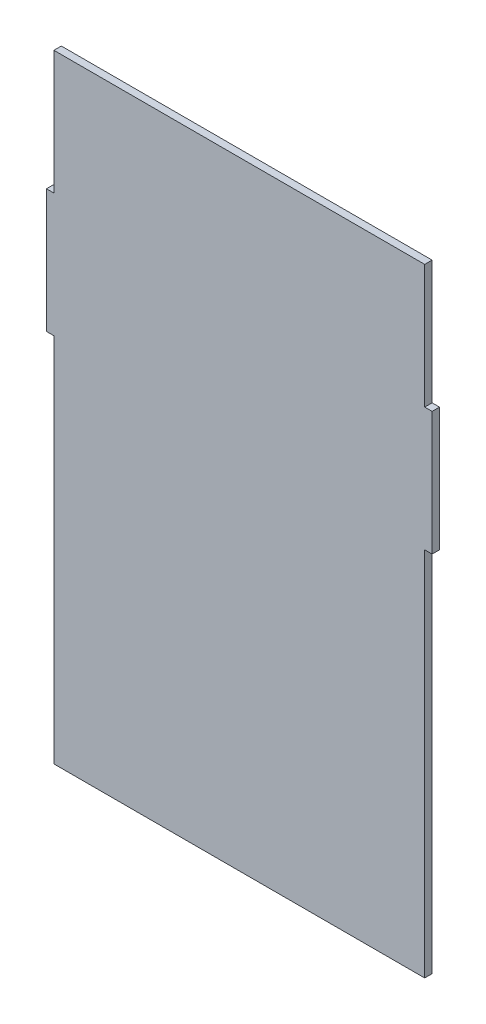
ISO-10303-21;
HEADER;
FILE_DESCRIPTION(('STEP AP214'),'2;1');
FILE_NAME('part.step','',(''),(''),'','','');
FILE_SCHEMA(('AUTOMOTIVE_DESIGN { 1 0 10303 214 1 1 1 1 }'));
ENDSEC;
DATA;
#1=APPLICATION_CONTEXT('core data for automotive mechanical design processes');
#2=APPLICATION_PROTOCOL_DEFINITION('international standard','automotive_design',2000,#1);
#3=PRODUCT_CONTEXT('',#1,'mechanical');
#4=PRODUCT('Part','Part','',(#3));
#5=PRODUCT_RELATED_PRODUCT_CATEGORY('part','',(#4));
#6=PRODUCT_DEFINITION_FORMATION('','',#4);
#7=PRODUCT_DEFINITION_CONTEXT('part definition',#1,'design');
#8=PRODUCT_DEFINITION('design','',#6,#7);
#9=PRODUCT_DEFINITION_SHAPE('','',#8);
#10=(LENGTH_UNIT() NAMED_UNIT(*) SI_UNIT(.MILLI.,.METRE.));
#11=(NAMED_UNIT(*) PLANE_ANGLE_UNIT() SI_UNIT($,.RADIAN.));
#12=(NAMED_UNIT(*) SI_UNIT($,.STERADIAN.) SOLID_ANGLE_UNIT());
#13=UNCERTAINTY_MEASURE_WITH_UNIT(LENGTH_MEASURE(1.E-05),#10,'distance_accuracy_value','');
#14=(GEOMETRIC_REPRESENTATION_CONTEXT(3) GLOBAL_UNCERTAINTY_ASSIGNED_CONTEXT((#13)) GLOBAL_UNIT_ASSIGNED_CONTEXT((#10,
#11,#12)) REPRESENTATION_CONTEXT('',''));
#15=CARTESIAN_POINT('',(0.,0.,0.));
#16=DIRECTION('',(0.,0.,1.));
#17=DIRECTION('',(1.,0.,0.));
#18=AXIS2_PLACEMENT_3D('',#15,#16,#17);
#19=CARTESIAN_POINT('',(0.,0.,3.));
#20=DIRECTION('',(1.,0.,0.));
#21=DIRECTION('',(0.,1.,0.));
#22=AXIS2_PLACEMENT_3D('',#19,#20,#21);
#23=PLANE('',#22);
#24=DIRECTION('',(0.,-1.,0.));
#25=VECTOR('',#24,1.);
#26=CARTESIAN_POINT('',(0.,0.,0.));
#27=LINE('',#26,#25);
#28=CARTESIAN_POINT('',(0.,150.,0.));
#29=VERTEX_POINT('',#28);
#30=CARTESIAN_POINT('',(0.,0.,0.));
#31=VERTEX_POINT('',#30);
#32=EDGE_CURVE('E164',#29,#31,#27,.T.);
#33=ORIENTED_EDGE('',*,*,#32,.T.);
#34=DIRECTION('',(0.,0.,-1.));
#35=VECTOR('',#34,1.);
#36=CARTESIAN_POINT('',(0.,0.,3.));
#37=LINE('',#36,#35);
#38=CARTESIAN_POINT('',(0.,0.,3.));
#39=VERTEX_POINT('',#38);
#40=EDGE_CURVE('E11',#39,#31,#37,.T.);
#41=ORIENTED_EDGE('',*,*,#40,.F.);
#42=DIRECTION('',(0.,-1.,0.));
#43=VECTOR('',#42,1.);
#44=CARTESIAN_POINT('',(0.,0.,3.));
#45=LINE('',#44,#43);
#46=CARTESIAN_POINT('',(0.,150.,3.));
#47=VERTEX_POINT('',#46);
#48=EDGE_CURVE('E198',#47,#39,#45,.T.);
#49=ORIENTED_EDGE('',*,*,#48,.F.);
#50=DIRECTION('',(0.,0.,-1.));
#51=VECTOR('',#50,1.);
#52=CARTESIAN_POINT('',(0.,150.,3.));
#53=LINE('',#52,#51);
#54=EDGE_CURVE('E160',#47,#29,#53,.T.);
#55=ORIENTED_EDGE('',*,*,#54,.T.);
#56=EDGE_LOOP('',(#33,#41,#49,#55));
#57=FACE_BOUND('',#56,.T.);
#58=ADVANCED_FACE('F39',(#57),#23,.F.);
#59=CARTESIAN_POINT('',(0.,0.,3.));
#60=DIRECTION('',(0.,1.,0.));
#61=DIRECTION('',(0.,0.,1.));
#62=AXIS2_PLACEMENT_3D('',#59,#60,#61);
#63=PLANE('',#62);
#64=DIRECTION('',(1.,0.,0.));
#65=VECTOR('',#64,1.);
#66=CARTESIAN_POINT('',(0.,0.,0.));
#67=LINE('',#66,#65);
#68=CARTESIAN_POINT('',(150.,0.,0.));
#69=VERTEX_POINT('',#68);
#70=EDGE_CURVE('E168',#31,#69,#67,.T.);
#71=ORIENTED_EDGE('',*,*,#70,.T.);
#72=DIRECTION('',(0.,0.,-1.));
#73=VECTOR('',#72,1.);
#74=CARTESIAN_POINT('',(150.,0.,3.));
#75=LINE('',#74,#73);
#76=CARTESIAN_POINT('',(150.,0.,3.));
#77=VERTEX_POINT('',#76);
#78=EDGE_CURVE('E48',#77,#69,#75,.T.);
#79=ORIENTED_EDGE('',*,*,#78,.F.);
#80=DIRECTION('',(1.,0.,0.));
#81=VECTOR('',#80,1.);
#82=CARTESIAN_POINT('',(0.,0.,3.));
#83=LINE('',#82,#81);
#84=EDGE_CURVE('E111',#39,#77,#83,.T.);
#85=ORIENTED_EDGE('',*,*,#84,.F.);
#86=ORIENTED_EDGE('',*,*,#40,.T.);
#87=EDGE_LOOP('',(#71,#79,#85,#86));
#88=FACE_BOUND('',#87,.T.);
#89=ADVANCED_FACE('F292',(#88),#63,.F.);
#90=CARTESIAN_POINT('',(150.,0.,3.));
#91=DIRECTION('',(-1.,0.,0.));
#92=DIRECTION('',(0.,0.,1.));
#93=AXIS2_PLACEMENT_3D('',#90,#91,#92);
#94=PLANE('',#93);
#95=DIRECTION('',(0.,1.,0.));
#96=VECTOR('',#95,1.);
#97=CARTESIAN_POINT('',(150.,0.,0.));
#98=LINE('',#97,#96);
#99=CARTESIAN_POINT('',(150.,150.,0.));
#100=VERTEX_POINT('',#99);
#101=EDGE_CURVE('E171',#69,#100,#98,.T.);
#102=ORIENTED_EDGE('',*,*,#101,.T.);
#103=DIRECTION('',(0.,0.,-1.));
#104=VECTOR('',#103,1.);
#105=CARTESIAN_POINT('',(150.,150.,3.));
#106=LINE('',#105,#104);
#107=CARTESIAN_POINT('',(150.,150.,3.));
#108=VERTEX_POINT('',#107);
#109=EDGE_CURVE('E225',#108,#100,#106,.T.);
#110=ORIENTED_EDGE('',*,*,#109,.F.);
#111=DIRECTION('',(0.,1.,0.));
#112=VECTOR('',#111,1.);
#113=CARTESIAN_POINT('',(150.,0.,3.));
#114=LINE('',#113,#112);
#115=EDGE_CURVE('E235',#77,#108,#114,.T.);
#116=ORIENTED_EDGE('',*,*,#115,.F.);
#117=ORIENTED_EDGE('',*,*,#78,.T.);
#118=EDGE_LOOP('',(#102,#110,#116,#117));
#119=FACE_BOUND('',#118,.T.);
#120=ADVANCED_FACE('F233',(#119),#94,.F.);
#121=CARTESIAN_POINT('',(150.,150.,3.));
#122=DIRECTION('',(0.,1.,0.));
#123=DIRECTION('',(0.,0.,1.));
#124=AXIS2_PLACEMENT_3D('',#121,#122,#123);
#125=PLANE('',#124);
#126=DIRECTION('',(1.,0.,0.));
#127=VECTOR('',#126,1.);
#128=CARTESIAN_POINT('',(150.,150.,0.));
#129=LINE('',#128,#127);
#130=CARTESIAN_POINT('',(153.,150.,0.));
#131=VERTEX_POINT('',#130);
#132=EDGE_CURVE('E174',#100,#131,#129,.T.);
#133=ORIENTED_EDGE('',*,*,#132,.T.);
#134=DIRECTION('',(0.,0.,-1.));
#135=VECTOR('',#134,1.);
#136=CARTESIAN_POINT('',(153.,150.,3.));
#137=LINE('',#136,#135);
#138=CARTESIAN_POINT('',(153.,150.,3.));
#139=VERTEX_POINT('',#138);
#140=EDGE_CURVE('E221',#139,#131,#137,.T.);
#141=ORIENTED_EDGE('',*,*,#140,.F.);
#142=DIRECTION('',(1.,0.,0.));
#143=VECTOR('',#142,1.);
#144=CARTESIAN_POINT('',(150.,150.,3.));
#145=LINE('',#144,#143);
#146=EDGE_CURVE('E254',#108,#139,#145,.T.);
#147=ORIENTED_EDGE('',*,*,#146,.F.);
#148=ORIENTED_EDGE('',*,*,#109,.T.);
#149=EDGE_LOOP('',(#133,#141,#147,#148));
#150=FACE_BOUND('',#149,.T.);
#151=ADVANCED_FACE('F244',(#150),#125,.F.);
#152=CARTESIAN_POINT('',(153.,150.,3.));
#153=DIRECTION('',(-1.,0.,0.));
#154=DIRECTION('',(0.,0.,1.));
#155=AXIS2_PLACEMENT_3D('',#152,#153,#154);
#156=PLANE('',#155);
#157=DIRECTION('',(0.,1.,0.));
#158=VECTOR('',#157,1.);
#159=CARTESIAN_POINT('',(153.,150.,0.));
#160=LINE('',#159,#158);
#161=CARTESIAN_POINT('',(153.,200.,0.));
#162=VERTEX_POINT('',#161);
#163=EDGE_CURVE('E177',#131,#162,#160,.T.);
#164=ORIENTED_EDGE('',*,*,#163,.T.);
#165=DIRECTION('',(0.,0.,-1.));
#166=VECTOR('',#165,1.);
#167=CARTESIAN_POINT('',(153.,200.,3.));
#168=LINE('',#167,#166);
#169=CARTESIAN_POINT('',(153.,200.,3.));
#170=VERTEX_POINT('',#169);
#171=EDGE_CURVE('E217',#170,#162,#168,.T.);
#172=ORIENTED_EDGE('',*,*,#171,.F.);
#173=DIRECTION('',(0.,1.,0.));
#174=VECTOR('',#173,1.);
#175=CARTESIAN_POINT('',(153.,150.,3.));
#176=LINE('',#175,#174);
#177=EDGE_CURVE('E250',#139,#170,#176,.T.);
#178=ORIENTED_EDGE('',*,*,#177,.F.);
#179=ORIENTED_EDGE('',*,*,#140,.T.);
#180=EDGE_LOOP('',(#164,#172,#178,#179));
#181=FACE_BOUND('',#180,.T.);
#182=ADVANCED_FACE('F248',(#181),#156,.F.);
#183=CARTESIAN_POINT('',(150.,200.,3.));
#184=DIRECTION('',(0.,-1.,0.));
#185=DIRECTION('',(0.,0.,-1.));
#186=AXIS2_PLACEMENT_3D('',#183,#184,#185);
#187=PLANE('',#186);
#188=DIRECTION('',(-1.,0.,0.));
#189=VECTOR('',#188,1.);
#190=CARTESIAN_POINT('',(150.,200.,0.));
#191=LINE('',#190,#189);
#192=CARTESIAN_POINT('',(150.,200.,0.));
#193=VERTEX_POINT('',#192);
#194=EDGE_CURVE('E180',#162,#193,#191,.T.);
#195=ORIENTED_EDGE('',*,*,#194,.T.);
#196=DIRECTION('',(0.,0.,-1.));
#197=VECTOR('',#196,1.);
#198=CARTESIAN_POINT('',(150.,200.,3.));
#199=LINE('',#198,#197);
#200=CARTESIAN_POINT('',(150.,200.,3.));
#201=VERTEX_POINT('',#200);
#202=EDGE_CURVE('E213',#201,#193,#199,.T.);
#203=ORIENTED_EDGE('',*,*,#202,.F.);
#204=DIRECTION('',(-1.,0.,0.));
#205=VECTOR('',#204,1.);
#206=CARTESIAN_POINT('',(150.,200.,3.));
#207=LINE('',#206,#205);
#208=EDGE_CURVE('E253',#170,#201,#207,.T.);
#209=ORIENTED_EDGE('',*,*,#208,.F.);
#210=ORIENTED_EDGE('',*,*,#171,.T.);
#211=EDGE_LOOP('',(#195,#203,#209,#210));
#212=FACE_BOUND('',#211,.T.);
#213=ADVANCED_FACE('F305',(#212),#187,.F.);
#214=CARTESIAN_POINT('',(150.,200.,3.));
#215=DIRECTION('',(-1.,0.,0.));
#216=DIRECTION('',(0.,0.,1.));
#217=AXIS2_PLACEMENT_3D('',#214,#215,#216);
#218=PLANE('',#217);
#219=DIRECTION('',(0.,1.,0.));
#220=VECTOR('',#219,1.);
#221=CARTESIAN_POINT('',(150.,200.,0.));
#222=LINE('',#221,#220);
#223=CARTESIAN_POINT('',(150.,250.,0.));
#224=VERTEX_POINT('',#223);
#225=EDGE_CURVE('E183',#193,#224,#222,.T.);
#226=ORIENTED_EDGE('',*,*,#225,.T.);
#227=DIRECTION('',(0.,0.,-1.));
#228=VECTOR('',#227,1.);
#229=CARTESIAN_POINT('',(150.,250.,3.));
#230=LINE('',#229,#228);
#231=CARTESIAN_POINT('',(150.,250.,3.));
#232=VERTEX_POINT('',#231);
#233=EDGE_CURVE('E209',#232,#224,#230,.T.);
#234=ORIENTED_EDGE('',*,*,#233,.F.);
#235=DIRECTION('',(0.,1.,0.));
#236=VECTOR('',#235,1.);
#237=CARTESIAN_POINT('',(150.,200.,3.));
#238=LINE('',#237,#236);
#239=EDGE_CURVE('E258',#201,#232,#238,.T.);
#240=ORIENTED_EDGE('',*,*,#239,.F.);
#241=ORIENTED_EDGE('',*,*,#202,.T.);
#242=EDGE_LOOP('',(#226,#234,#240,#241));
#243=FACE_BOUND('',#242,.T.);
#244=ADVANCED_FACE('F308',(#243),#218,.F.);
#245=CARTESIAN_POINT('',(0.,250.,3.));
#246=DIRECTION('',(0.,-1.,0.));
#247=DIRECTION('',(0.,0.,-1.));
#248=AXIS2_PLACEMENT_3D('',#245,#246,#247);
#249=PLANE('',#248);
#250=DIRECTION('',(-1.,0.,0.));
#251=VECTOR('',#250,1.);
#252=CARTESIAN_POINT('',(0.,250.,0.));
#253=LINE('',#252,#251);
#254=CARTESIAN_POINT('',(0.,250.,0.));
#255=VERTEX_POINT('',#254);
#256=EDGE_CURVE('E186',#224,#255,#253,.T.);
#257=ORIENTED_EDGE('',*,*,#256,.T.);
#258=DIRECTION('',(0.,0.,-1.));
#259=VECTOR('',#258,1.);
#260=CARTESIAN_POINT('',(0.,250.,3.));
#261=LINE('',#260,#259);
#262=CARTESIAN_POINT('',(0.,250.,3.));
#263=VERTEX_POINT('',#262);
#264=EDGE_CURVE('E205',#263,#255,#261,.T.);
#265=ORIENTED_EDGE('',*,*,#264,.F.);
#266=DIRECTION('',(-1.,0.,0.));
#267=VECTOR('',#266,1.);
#268=CARTESIAN_POINT('',(0.,250.,3.));
#269=LINE('',#268,#267);
#270=EDGE_CURVE('E265',#232,#263,#269,.T.);
#271=ORIENTED_EDGE('',*,*,#270,.F.);
#272=ORIENTED_EDGE('',*,*,#233,.T.);
#273=EDGE_LOOP('',(#257,#265,#271,#272));
#274=FACE_BOUND('',#273,.T.);
#275=ADVANCED_FACE('F273',(#274),#249,.F.);
#276=CARTESIAN_POINT('',(0.,200.,3.));
#277=DIRECTION('',(1.,0.,0.));
#278=DIRECTION('',(0.,1.,0.));
#279=AXIS2_PLACEMENT_3D('',#276,#277,#278);
#280=PLANE('',#279);
#281=DIRECTION('',(0.,-1.,0.));
#282=VECTOR('',#281,1.);
#283=CARTESIAN_POINT('',(0.,200.,0.));
#284=LINE('',#283,#282);
#285=CARTESIAN_POINT('',(0.,200.,0.));
#286=VERTEX_POINT('',#285);
#287=EDGE_CURVE('E189',#255,#286,#284,.T.);
#288=ORIENTED_EDGE('',*,*,#287,.T.);
#289=DIRECTION('',(0.,0.,-1.));
#290=VECTOR('',#289,1.);
#291=CARTESIAN_POINT('',(0.,200.,3.));
#292=LINE('',#291,#290);
#293=CARTESIAN_POINT('',(0.,200.,3.));
#294=VERTEX_POINT('',#293);
#295=EDGE_CURVE('E153',#294,#286,#292,.T.);
#296=ORIENTED_EDGE('',*,*,#295,.F.);
#297=DIRECTION('',(0.,-1.,0.));
#298=VECTOR('',#297,1.);
#299=CARTESIAN_POINT('',(0.,200.,3.));
#300=LINE('',#299,#298);
#301=EDGE_CURVE('E142',#263,#294,#300,.T.);
#302=ORIENTED_EDGE('',*,*,#301,.F.);
#303=ORIENTED_EDGE('',*,*,#264,.T.);
#304=EDGE_LOOP('',(#288,#296,#302,#303));
#305=FACE_BOUND('',#304,.T.);
#306=ADVANCED_FACE('F277',(#305),#280,.F.);
#307=CARTESIAN_POINT('',(0.,200.,3.));
#308=DIRECTION('',(0.,-1.,0.));
#309=DIRECTION('',(0.,0.,-1.));
#310=AXIS2_PLACEMENT_3D('',#307,#308,#309);
#311=PLANE('',#310);
#312=DIRECTION('',(-1.,0.,0.));
#313=VECTOR('',#312,1.);
#314=CARTESIAN_POINT('',(0.,200.,0.));
#315=LINE('',#314,#313);
#316=CARTESIAN_POINT('',(-3.00000000000001,200.,0.));
#317=VERTEX_POINT('',#316);
#318=EDGE_CURVE('E151',#286,#317,#315,.T.);
#319=ORIENTED_EDGE('',*,*,#318,.T.);
#320=DIRECTION('',(0.,0.,-1.));
#321=VECTOR('',#320,1.);
#322=CARTESIAN_POINT('',(-3.00000000000001,200.,3.));
#323=LINE('',#322,#321);
#324=CARTESIAN_POINT('',(-3.00000000000001,200.,3.));
#325=VERTEX_POINT('',#324);
#326=EDGE_CURVE('E148',#325,#317,#323,.T.);
#327=ORIENTED_EDGE('',*,*,#326,.F.);
#328=DIRECTION('',(-1.,0.,0.));
#329=VECTOR('',#328,1.);
#330=CARTESIAN_POINT('',(0.,200.,3.));
#331=LINE('',#330,#329);
#332=EDGE_CURVE('E136',#294,#325,#331,.T.);
#333=ORIENTED_EDGE('',*,*,#332,.F.);
#334=ORIENTED_EDGE('',*,*,#295,.T.);
#335=EDGE_LOOP('',(#319,#327,#333,#334));
#336=FACE_BOUND('',#335,.T.);
#337=ADVANCED_FACE('F149',(#336),#311,.F.);
#338=CARTESIAN_POINT('',(-3.00000000000001,200.,3.));
#339=DIRECTION('',(1.,0.,0.));
#340=DIRECTION('',(0.,0.,-1.));
#341=AXIS2_PLACEMENT_3D('',#338,#339,#340);
#342=PLANE('',#341);
#343=DIRECTION('',(0.,-1.,0.));
#344=VECTOR('',#343,1.);
#345=CARTESIAN_POINT('',(-3.00000000000001,200.,0.));
#346=LINE('',#345,#344);
#347=CARTESIAN_POINT('',(-3.00000000000001,150.,0.));
#348=VERTEX_POINT('',#347);
#349=EDGE_CURVE('E97',#317,#348,#346,.T.);
#350=ORIENTED_EDGE('',*,*,#349,.T.);
#351=DIRECTION('',(0.,0.,-1.));
#352=VECTOR('',#351,1.);
#353=CARTESIAN_POINT('',(-3.00000000000001,150.,3.));
#354=LINE('',#353,#352);
#355=CARTESIAN_POINT('',(-3.00000000000001,150.,3.));
#356=VERTEX_POINT('',#355);
#357=EDGE_CURVE('E154',#356,#348,#354,.T.);
#358=ORIENTED_EDGE('',*,*,#357,.F.);
#359=DIRECTION('',(0.,-1.,0.));
#360=VECTOR('',#359,1.);
#361=CARTESIAN_POINT('',(-3.00000000000001,200.,3.));
#362=LINE('',#361,#360);
#363=EDGE_CURVE('E140',#325,#356,#362,.T.);
#364=ORIENTED_EDGE('',*,*,#363,.F.);
#365=ORIENTED_EDGE('',*,*,#326,.T.);
#366=EDGE_LOOP('',(#350,#358,#364,#365));
#367=FACE_BOUND('',#366,.T.);
#368=ADVANCED_FACE('F156',(#367),#342,.F.);
#369=CARTESIAN_POINT('',(0.,150.,3.));
#370=DIRECTION('',(0.,1.,0.));
#371=DIRECTION('',(0.,0.,1.));
#372=AXIS2_PLACEMENT_3D('',#369,#370,#371);
#373=PLANE('',#372);
#374=DIRECTION('',(1.,0.,0.));
#375=VECTOR('',#374,1.);
#376=CARTESIAN_POINT('',(0.,150.,0.));
#377=LINE('',#376,#375);
#378=EDGE_CURVE('E103',#348,#29,#377,.T.);
#379=ORIENTED_EDGE('',*,*,#378,.T.);
#380=ORIENTED_EDGE('',*,*,#54,.F.);
#381=DIRECTION('',(1.,0.,0.));
#382=VECTOR('',#381,1.);
#383=CARTESIAN_POINT('',(0.,150.,3.));
#384=LINE('',#383,#382);
#385=EDGE_CURVE('E56',#356,#47,#384,.T.);
#386=ORIENTED_EDGE('',*,*,#385,.F.);
#387=ORIENTED_EDGE('',*,*,#357,.T.);
#388=EDGE_LOOP('',(#379,#380,#386,#387));
#389=FACE_BOUND('',#388,.T.);
#390=ADVANCED_FACE('F281',(#389),#373,.F.);
#391=CARTESIAN_POINT('',(0.,0.,3.));
#392=DIRECTION('',(0.,0.,1.));
#393=DIRECTION('',(1.,0.,0.));
#394=AXIS2_PLACEMENT_3D('',#391,#392,#393);
#395=PLANE('',#394);
#396=ORIENTED_EDGE('',*,*,#48,.T.);
#397=ORIENTED_EDGE('',*,*,#84,.T.);
#398=ORIENTED_EDGE('',*,*,#115,.T.);
#399=ORIENTED_EDGE('',*,*,#146,.T.);
#400=ORIENTED_EDGE('',*,*,#177,.T.);
#401=ORIENTED_EDGE('',*,*,#208,.T.);
#402=ORIENTED_EDGE('',*,*,#239,.T.);
#403=ORIENTED_EDGE('',*,*,#270,.T.);
#404=ORIENTED_EDGE('',*,*,#301,.T.);
#405=ORIENTED_EDGE('',*,*,#332,.T.);
#406=ORIENTED_EDGE('',*,*,#363,.T.);
#407=ORIENTED_EDGE('',*,*,#385,.T.);
#408=EDGE_LOOP('',(#396,#397,#398,#399,#400,#401,#402,#403,#404,#405,#406,#407));
#409=FACE_BOUND('',#408,.T.);
#410=ADVANCED_FACE('F138',(#409),#395,.T.);
#411=CARTESIAN_POINT('',(0.,0.,0.));
#412=DIRECTION('',(0.,0.,1.));
#413=DIRECTION('',(1.,0.,0.));
#414=AXIS2_PLACEMENT_3D('',#411,#412,#413);
#415=PLANE('',#414);
#416=ORIENTED_EDGE('',*,*,#32,.F.);
#417=ORIENTED_EDGE('',*,*,#378,.F.);
#418=ORIENTED_EDGE('',*,*,#349,.F.);
#419=ORIENTED_EDGE('',*,*,#318,.F.);
#420=ORIENTED_EDGE('',*,*,#287,.F.);
#421=ORIENTED_EDGE('',*,*,#256,.F.);
#422=ORIENTED_EDGE('',*,*,#225,.F.);
#423=ORIENTED_EDGE('',*,*,#194,.F.);
#424=ORIENTED_EDGE('',*,*,#163,.F.);
#425=ORIENTED_EDGE('',*,*,#132,.F.);
#426=ORIENTED_EDGE('',*,*,#101,.F.);
#427=ORIENTED_EDGE('',*,*,#70,.F.);
#428=EDGE_LOOP('',(#416,#417,#418,#419,#420,#421,#422,#423,#424,#425,#426,#427));
#429=FACE_BOUND('',#428,.T.);
#430=ADVANCED_FACE('F239',(#429),#415,.F.);
#431=CLOSED_SHELL('',(#58,#89,#120,#151,#182,#213,#244,#275,#306,#337,#368,#390,#410,#430));
#432=MANIFOLD_SOLID_BREP('B2',#431);
#433=ADVANCED_BREP_SHAPE_REPRESENTATION('',(#18,#432),#14);
#434=SHAPE_DEFINITION_REPRESENTATION(#9,#433);
ENDSEC;
END-ISO-10303-21;
